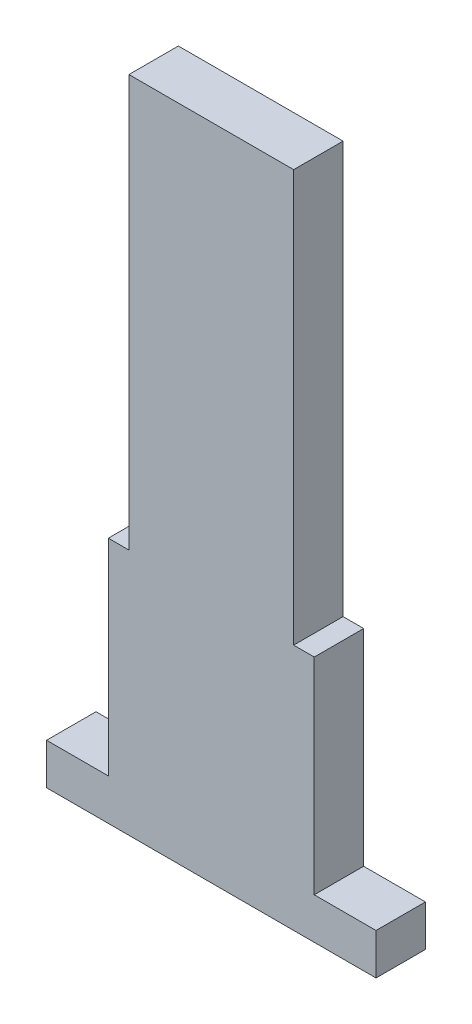
ISO-10303-21;
HEADER;
FILE_DESCRIPTION(('STEP AP214'),'2;1');
FILE_NAME('part.step','',(''),(''),'','','');
FILE_SCHEMA(('AUTOMOTIVE_DESIGN { 1 0 10303 214 1 1 1 1 }'));
ENDSEC;
DATA;
#1=APPLICATION_CONTEXT('core data for automotive mechanical design processes');
#2=APPLICATION_PROTOCOL_DEFINITION('international standard','automotive_design',2000,#1);
#3=PRODUCT_CONTEXT('',#1,'mechanical');
#4=PRODUCT('Part','Part','',(#3));
#5=PRODUCT_RELATED_PRODUCT_CATEGORY('part','',(#4));
#6=PRODUCT_DEFINITION_FORMATION('','',#4);
#7=PRODUCT_DEFINITION_CONTEXT('part definition',#1,'design');
#8=PRODUCT_DEFINITION('design','',#6,#7);
#9=PRODUCT_DEFINITION_SHAPE('','',#8);
#10=(LENGTH_UNIT() NAMED_UNIT(*) SI_UNIT(.MILLI.,.METRE.));
#11=(NAMED_UNIT(*) PLANE_ANGLE_UNIT() SI_UNIT($,.RADIAN.));
#12=(NAMED_UNIT(*) SI_UNIT($,.STERADIAN.) SOLID_ANGLE_UNIT());
#13=UNCERTAINTY_MEASURE_WITH_UNIT(LENGTH_MEASURE(1.E-05),#10,'distance_accuracy_value','');
#14=(GEOMETRIC_REPRESENTATION_CONTEXT(3) GLOBAL_UNCERTAINTY_ASSIGNED_CONTEXT((#13)) GLOBAL_UNIT_ASSIGNED_CONTEXT((#10,
#11,#12)) REPRESENTATION_CONTEXT('',''));
#15=CARTESIAN_POINT('',(0.,0.,0.));
#16=DIRECTION('',(0.,0.,1.));
#17=DIRECTION('',(1.,0.,0.));
#18=AXIS2_PLACEMENT_3D('',#15,#16,#17);
#19=CARTESIAN_POINT('',(-4.,0.,0.6));
#20=DIRECTION('',(0.,-1.,0.));
#21=DIRECTION('',(1.,0.,0.));
#22=AXIS2_PLACEMENT_3D('',#19,#20,#21);
#23=PLANE('',#22);
#24=DIRECTION('',(-1.,0.,0.));
#25=VECTOR('',#24,1.);
#26=CARTESIAN_POINT('',(-4.,0.,-0.6));
#27=LINE('',#26,#25);
#28=CARTESIAN_POINT('',(-2.5,0.,-0.6));
#29=VERTEX_POINT('',#28);
#30=CARTESIAN_POINT('',(-4.,0.,-0.6));
#31=VERTEX_POINT('',#30);
#32=EDGE_CURVE('E152',#29,#31,#27,.T.);
#33=ORIENTED_EDGE('',*,*,#32,.T.);
#34=DIRECTION('',(0.,0.,-1.));
#35=VECTOR('',#34,1.);
#36=CARTESIAN_POINT('',(-4.,0.,0.6));
#37=LINE('',#36,#35);
#38=CARTESIAN_POINT('',(-4.,0.,0.6));
#39=VERTEX_POINT('',#38);
#40=EDGE_CURVE('E11',#39,#31,#37,.T.);
#41=ORIENTED_EDGE('',*,*,#40,.F.);
#42=DIRECTION('',(-1.,0.,0.));
#43=VECTOR('',#42,1.);
#44=CARTESIAN_POINT('',(-4.,0.,0.6));
#45=LINE('',#44,#43);
#46=CARTESIAN_POINT('',(-2.5,0.,0.6));
#47=VERTEX_POINT('',#46);
#48=EDGE_CURVE('E174',#47,#39,#45,.T.);
#49=ORIENTED_EDGE('',*,*,#48,.F.);
#50=DIRECTION('',(0.,0.,-1.));
#51=VECTOR('',#50,1.);
#52=CARTESIAN_POINT('',(-2.5,0.,0.6));
#53=LINE('',#52,#51);
#54=EDGE_CURVE('E148',#47,#29,#53,.T.);
#55=ORIENTED_EDGE('',*,*,#54,.T.);
#56=EDGE_LOOP('',(#33,#41,#49,#55));
#57=FACE_BOUND('',#56,.T.);
#58=ADVANCED_FACE('F32',(#57),#23,.F.);
#59=CARTESIAN_POINT('',(-4.,0.,0.6));
#60=DIRECTION('',(1.,0.,0.));
#61=DIRECTION('',(0.,0.,-1.));
#62=AXIS2_PLACEMENT_3D('',#59,#60,#61);
#63=PLANE('',#62);
#64=DIRECTION('',(0.,-1.,0.));
#65=VECTOR('',#64,1.);
#66=CARTESIAN_POINT('',(-4.,0.,-0.6));
#67=LINE('',#66,#65);
#68=CARTESIAN_POINT('',(-4.,-0.999999999999992,-0.6));
#69=VERTEX_POINT('',#68);
#70=EDGE_CURVE('E155',#31,#69,#67,.T.);
#71=ORIENTED_EDGE('',*,*,#70,.T.);
#72=DIRECTION('',(0.,0.,-1.));
#73=VECTOR('',#72,1.);
#74=CARTESIAN_POINT('',(-4.,-0.999999999999992,0.6));
#75=LINE('',#74,#73);
#76=CARTESIAN_POINT('',(-4.,-0.999999999999992,0.6));
#77=VERTEX_POINT('',#76);
#78=EDGE_CURVE('E40',#77,#69,#75,.T.);
#79=ORIENTED_EDGE('',*,*,#78,.F.);
#80=DIRECTION('',(0.,-1.,0.));
#81=VECTOR('',#80,1.);
#82=CARTESIAN_POINT('',(-4.,0.,0.6));
#83=LINE('',#82,#81);
#84=EDGE_CURVE('E103',#39,#77,#83,.T.);
#85=ORIENTED_EDGE('',*,*,#84,.F.);
#86=ORIENTED_EDGE('',*,*,#40,.T.);
#87=EDGE_LOOP('',(#71,#79,#85,#86));
#88=FACE_BOUND('',#87,.T.);
#89=ADVANCED_FACE('F252',(#88),#63,.F.);
#90=CARTESIAN_POINT('',(-4.,-0.999999999999992,0.6));
#91=DIRECTION('',(0.,1.,0.));
#92=DIRECTION('',(-1.,0.,0.));
#93=AXIS2_PLACEMENT_3D('',#90,#91,#92);
#94=PLANE('',#93);
#95=DIRECTION('',(1.,0.,0.));
#96=VECTOR('',#95,1.);
#97=CARTESIAN_POINT('',(-4.,-0.999999999999992,-0.6));
#98=LINE('',#97,#96);
#99=CARTESIAN_POINT('',(4.,-0.999999999999993,-0.6));
#100=VERTEX_POINT('',#99);
#101=EDGE_CURVE('E157',#69,#100,#98,.T.);
#102=ORIENTED_EDGE('',*,*,#101,.T.);
#103=DIRECTION('',(0.,0.,-1.));
#104=VECTOR('',#103,1.);
#105=CARTESIAN_POINT('',(4.,-0.999999999999993,0.6));
#106=LINE('',#105,#104);
#107=CARTESIAN_POINT('',(4.,-0.999999999999993,0.6));
#108=VERTEX_POINT('',#107);
#109=EDGE_CURVE('E193',#108,#100,#106,.T.);
#110=ORIENTED_EDGE('',*,*,#109,.F.);
#111=DIRECTION('',(1.,0.,0.));
#112=VECTOR('',#111,1.);
#113=CARTESIAN_POINT('',(-4.,-0.999999999999992,0.6));
#114=LINE('',#113,#112);
#115=EDGE_CURVE('E201',#77,#108,#114,.T.);
#116=ORIENTED_EDGE('',*,*,#115,.F.);
#117=ORIENTED_EDGE('',*,*,#78,.T.);
#118=EDGE_LOOP('',(#102,#110,#116,#117));
#119=FACE_BOUND('',#118,.T.);
#120=ADVANCED_FACE('F199',(#119),#94,.F.);
#121=CARTESIAN_POINT('',(4.,0.,0.6));
#122=DIRECTION('',(-1.,0.,0.));
#123=DIRECTION('',(0.,0.,1.));
#124=AXIS2_PLACEMENT_3D('',#121,#122,#123);
#125=PLANE('',#124);
#126=DIRECTION('',(0.,1.,0.));
#127=VECTOR('',#126,1.);
#128=CARTESIAN_POINT('',(4.,0.,-0.6));
#129=LINE('',#128,#127);
#130=CARTESIAN_POINT('',(4.,0.,-0.6));
#131=VERTEX_POINT('',#130);
#132=EDGE_CURVE('E159',#100,#131,#129,.T.);
#133=ORIENTED_EDGE('',*,*,#132,.T.);
#134=DIRECTION('',(0.,0.,-1.));
#135=VECTOR('',#134,1.);
#136=CARTESIAN_POINT('',(4.,0.,0.6));
#137=LINE('',#136,#135);
#138=CARTESIAN_POINT('',(4.,0.,0.6));
#139=VERTEX_POINT('',#138);
#140=EDGE_CURVE('E190',#139,#131,#137,.T.);
#141=ORIENTED_EDGE('',*,*,#140,.F.);
#142=DIRECTION('',(0.,1.,0.));
#143=VECTOR('',#142,1.);
#144=CARTESIAN_POINT('',(4.,0.,0.6));
#145=LINE('',#144,#143);
#146=EDGE_CURVE('E219',#108,#139,#145,.T.);
#147=ORIENTED_EDGE('',*,*,#146,.F.);
#148=ORIENTED_EDGE('',*,*,#109,.T.);
#149=EDGE_LOOP('',(#133,#141,#147,#148));
#150=FACE_BOUND('',#149,.T.);
#151=ADVANCED_FACE('F210',(#150),#125,.F.);
#152=CARTESIAN_POINT('',(2.5,0.,0.6));
#153=DIRECTION('',(0.,-1.,0.));
#154=DIRECTION('',(0.,0.,-1.));
#155=AXIS2_PLACEMENT_3D('',#152,#153,#154);
#156=PLANE('',#155);
#157=DIRECTION('',(-1.,0.,0.));
#158=VECTOR('',#157,1.);
#159=CARTESIAN_POINT('',(2.5,0.,-0.6));
#160=LINE('',#159,#158);
#161=CARTESIAN_POINT('',(2.5,0.,-0.6));
#162=VERTEX_POINT('',#161);
#163=EDGE_CURVE('E161',#131,#162,#160,.T.);
#164=ORIENTED_EDGE('',*,*,#163,.T.);
#165=DIRECTION('',(0.,0.,-1.));
#166=VECTOR('',#165,1.);
#167=CARTESIAN_POINT('',(2.5,0.,0.6));
#168=LINE('',#167,#166);
#169=CARTESIAN_POINT('',(2.5,0.,0.6));
#170=VERTEX_POINT('',#169);
#171=EDGE_CURVE('E187',#170,#162,#168,.T.);
#172=ORIENTED_EDGE('',*,*,#171,.F.);
#173=DIRECTION('',(-1.,0.,0.));
#174=VECTOR('',#173,1.);
#175=CARTESIAN_POINT('',(2.5,0.,0.6));
#176=LINE('',#175,#174);
#177=EDGE_CURVE('E216',#139,#170,#176,.T.);
#178=ORIENTED_EDGE('',*,*,#177,.F.);
#179=ORIENTED_EDGE('',*,*,#140,.T.);
#180=EDGE_LOOP('',(#164,#172,#178,#179));
#181=FACE_BOUND('',#180,.T.);
#182=ADVANCED_FACE('F214',(#181),#156,.F.);
#183=CARTESIAN_POINT('',(2.5,0.,0.6));
#184=DIRECTION('',(-1.,0.,0.));
#185=DIRECTION('',(0.,0.,1.));
#186=AXIS2_PLACEMENT_3D('',#183,#184,#185);
#187=PLANE('',#186);
#188=DIRECTION('',(0.,1.,0.));
#189=VECTOR('',#188,1.);
#190=CARTESIAN_POINT('',(2.5,0.,-0.6));
#191=LINE('',#190,#189);
#192=CARTESIAN_POINT('',(2.5,5.,-0.6));
#193=VERTEX_POINT('',#192);
#194=EDGE_CURVE('E163',#162,#193,#191,.T.);
#195=ORIENTED_EDGE('',*,*,#194,.T.);
#196=DIRECTION('',(0.,0.,-1.));
#197=VECTOR('',#196,1.);
#198=CARTESIAN_POINT('',(2.5,5.,0.6));
#199=LINE('',#198,#197);
#200=CARTESIAN_POINT('',(2.5,5.,0.6));
#201=VERTEX_POINT('',#200);
#202=EDGE_CURVE('E184',#201,#193,#199,.T.);
#203=ORIENTED_EDGE('',*,*,#202,.F.);
#204=DIRECTION('',(0.,1.,0.));
#205=VECTOR('',#204,1.);
#206=CARTESIAN_POINT('',(2.5,0.,0.6));
#207=LINE('',#206,#205);
#208=EDGE_CURVE('E218',#170,#201,#207,.T.);
#209=ORIENTED_EDGE('',*,*,#208,.F.);
#210=ORIENTED_EDGE('',*,*,#171,.T.);
#211=EDGE_LOOP('',(#195,#203,#209,#210));
#212=FACE_BOUND('',#211,.T.);
#213=ADVANCED_FACE('F265',(#212),#187,.F.);
#214=CARTESIAN_POINT('',(2.,5.,0.6));
#215=DIRECTION('',(0.,-1.,0.));
#216=DIRECTION('',(1.,0.,0.));
#217=AXIS2_PLACEMENT_3D('',#214,#215,#216);
#218=PLANE('',#217);
#219=DIRECTION('',(-1.,0.,0.));
#220=VECTOR('',#219,1.);
#221=CARTESIAN_POINT('',(2.,5.,-0.6));
#222=LINE('',#221,#220);
#223=CARTESIAN_POINT('',(2.,5.,-0.6));
#224=VERTEX_POINT('',#223);
#225=EDGE_CURVE('E165',#193,#224,#222,.T.);
#226=ORIENTED_EDGE('',*,*,#225,.T.);
#227=DIRECTION('',(0.,0.,-1.));
#228=VECTOR('',#227,1.);
#229=CARTESIAN_POINT('',(2.,5.,0.6));
#230=LINE('',#229,#228);
#231=CARTESIAN_POINT('',(2.,5.,0.6));
#232=VERTEX_POINT('',#231);
#233=EDGE_CURVE('E181',#232,#224,#230,.T.);
#234=ORIENTED_EDGE('',*,*,#233,.F.);
#235=DIRECTION('',(-1.,0.,0.));
#236=VECTOR('',#235,1.);
#237=CARTESIAN_POINT('',(2.,5.,0.6));
#238=LINE('',#237,#236);
#239=EDGE_CURVE('E221',#201,#232,#238,.T.);
#240=ORIENTED_EDGE('',*,*,#239,.F.);
#241=ORIENTED_EDGE('',*,*,#202,.T.);
#242=EDGE_LOOP('',(#226,#234,#240,#241));
#243=FACE_BOUND('',#242,.T.);
#244=ADVANCED_FACE('F268',(#243),#218,.F.);
#245=CARTESIAN_POINT('',(2.,5.,0.6));
#246=DIRECTION('',(-1.,0.,0.));
#247=DIRECTION('',(0.,-1.,0.));
#248=AXIS2_PLACEMENT_3D('',#245,#246,#247);
#249=PLANE('',#248);
#250=DIRECTION('',(0.,1.,0.));
#251=VECTOR('',#250,1.);
#252=CARTESIAN_POINT('',(2.,5.,-0.6));
#253=LINE('',#252,#251);
#254=CARTESIAN_POINT('',(2.,15.,-0.6));
#255=VERTEX_POINT('',#254);
#256=EDGE_CURVE('E167',#224,#255,#253,.T.);
#257=ORIENTED_EDGE('',*,*,#256,.T.);
#258=DIRECTION('',(0.,0.,-1.));
#259=VECTOR('',#258,1.);
#260=CARTESIAN_POINT('',(2.,15.,0.6));
#261=LINE('',#260,#259);
#262=CARTESIAN_POINT('',(2.,15.,0.6));
#263=VERTEX_POINT('',#262);
#264=EDGE_CURVE('E178',#263,#255,#261,.T.);
#265=ORIENTED_EDGE('',*,*,#264,.F.);
#266=DIRECTION('',(0.,1.,0.));
#267=VECTOR('',#266,1.);
#268=CARTESIAN_POINT('',(2.,5.,0.6));
#269=LINE('',#268,#267);
#270=EDGE_CURVE('E227',#232,#263,#269,.T.);
#271=ORIENTED_EDGE('',*,*,#270,.F.);
#272=ORIENTED_EDGE('',*,*,#233,.T.);
#273=EDGE_LOOP('',(#257,#265,#271,#272));
#274=FACE_BOUND('',#273,.T.);
#275=ADVANCED_FACE('F233',(#274),#249,.F.);
#276=CARTESIAN_POINT('',(2.,15.,0.6));
#277=DIRECTION('',(0.,-1.,0.));
#278=DIRECTION('',(0.,0.,-1.));
#279=AXIS2_PLACEMENT_3D('',#276,#277,#278);
#280=PLANE('',#279);
#281=DIRECTION('',(-1.,0.,0.));
#282=VECTOR('',#281,1.);
#283=CARTESIAN_POINT('',(2.,15.,-0.6));
#284=LINE('',#283,#282);
#285=CARTESIAN_POINT('',(-2.,15.,-0.6));
#286=VERTEX_POINT('',#285);
#287=EDGE_CURVE('E169',#255,#286,#284,.T.);
#288=ORIENTED_EDGE('',*,*,#287,.T.);
#289=DIRECTION('',(0.,0.,-1.));
#290=VECTOR('',#289,1.);
#291=CARTESIAN_POINT('',(-2.,15.,0.6));
#292=LINE('',#291,#290);
#293=CARTESIAN_POINT('',(-2.,15.,0.6));
#294=VERTEX_POINT('',#293);
#295=EDGE_CURVE('E143',#294,#286,#292,.T.);
#296=ORIENTED_EDGE('',*,*,#295,.F.);
#297=DIRECTION('',(-1.,0.,0.));
#298=VECTOR('',#297,1.);
#299=CARTESIAN_POINT('',(2.,15.,0.6));
#300=LINE('',#299,#298);
#301=EDGE_CURVE('E134',#263,#294,#300,.T.);
#302=ORIENTED_EDGE('',*,*,#301,.F.);
#303=ORIENTED_EDGE('',*,*,#264,.T.);
#304=EDGE_LOOP('',(#288,#296,#302,#303));
#305=FACE_BOUND('',#304,.T.);
#306=ADVANCED_FACE('F237',(#305),#280,.F.);
#307=CARTESIAN_POINT('',(-2.,5.,0.6));
#308=DIRECTION('',(1.,0.,0.));
#309=DIRECTION('',(0.,1.,0.));
#310=AXIS2_PLACEMENT_3D('',#307,#308,#309);
#311=PLANE('',#310);
#312=DIRECTION('',(0.,-1.,0.));
#313=VECTOR('',#312,1.);
#314=CARTESIAN_POINT('',(-2.,5.,-0.6));
#315=LINE('',#314,#313);
#316=CARTESIAN_POINT('',(-2.,5.,-0.6));
#317=VERTEX_POINT('',#316);
#318=EDGE_CURVE('E142',#286,#317,#315,.T.);
#319=ORIENTED_EDGE('',*,*,#318,.T.);
#320=DIRECTION('',(0.,0.,-1.));
#321=VECTOR('',#320,1.);
#322=CARTESIAN_POINT('',(-2.,5.,0.6));
#323=LINE('',#322,#321);
#324=CARTESIAN_POINT('',(-2.,5.,0.6));
#325=VERTEX_POINT('',#324);
#326=EDGE_CURVE('E139',#325,#317,#323,.T.);
#327=ORIENTED_EDGE('',*,*,#326,.F.);
#328=DIRECTION('',(0.,-1.,0.));
#329=VECTOR('',#328,1.);
#330=CARTESIAN_POINT('',(-2.,5.,0.6));
#331=LINE('',#330,#329);
#332=EDGE_CURVE('E128',#294,#325,#331,.T.);
#333=ORIENTED_EDGE('',*,*,#332,.F.);
#334=ORIENTED_EDGE('',*,*,#295,.T.);
#335=EDGE_LOOP('',(#319,#327,#333,#334));
#336=FACE_BOUND('',#335,.T.);
#337=ADVANCED_FACE('F140',(#336),#311,.F.);
#338=CARTESIAN_POINT('',(-2.5,5.,0.6));
#339=DIRECTION('',(0.,-1.,0.));
#340=DIRECTION('',(0.,0.,-1.));
#341=AXIS2_PLACEMENT_3D('',#338,#339,#340);
#342=PLANE('',#341);
#343=DIRECTION('',(-1.,0.,0.));
#344=VECTOR('',#343,1.);
#345=CARTESIAN_POINT('',(-2.5,5.,-0.6));
#346=LINE('',#345,#344);
#347=CARTESIAN_POINT('',(-2.5,5.,-0.6));
#348=VERTEX_POINT('',#347);
#349=EDGE_CURVE('E89',#317,#348,#346,.T.);
#350=ORIENTED_EDGE('',*,*,#349,.T.);
#351=DIRECTION('',(0.,0.,-1.));
#352=VECTOR('',#351,1.);
#353=CARTESIAN_POINT('',(-2.5,5.,0.6));
#354=LINE('',#353,#352);
#355=CARTESIAN_POINT('',(-2.5,5.,0.6));
#356=VERTEX_POINT('',#355);
#357=EDGE_CURVE('E144',#356,#348,#354,.T.);
#358=ORIENTED_EDGE('',*,*,#357,.F.);
#359=DIRECTION('',(-1.,0.,0.));
#360=VECTOR('',#359,1.);
#361=CARTESIAN_POINT('',(-2.5,5.,0.6));
#362=LINE('',#361,#360);
#363=EDGE_CURVE('E132',#325,#356,#362,.T.);
#364=ORIENTED_EDGE('',*,*,#363,.F.);
#365=ORIENTED_EDGE('',*,*,#326,.T.);
#366=EDGE_LOOP('',(#350,#358,#364,#365));
#367=FACE_BOUND('',#366,.T.);
#368=ADVANCED_FACE('F146',(#367),#342,.F.);
#369=CARTESIAN_POINT('',(-2.5,0.,0.6));
#370=DIRECTION('',(1.,0.,0.));
#371=DIRECTION('',(0.,0.,-1.));
#372=AXIS2_PLACEMENT_3D('',#369,#370,#371);
#373=PLANE('',#372);
#374=DIRECTION('',(0.,-1.,0.));
#375=VECTOR('',#374,1.);
#376=CARTESIAN_POINT('',(-2.5,0.,-0.6));
#377=LINE('',#376,#375);
#378=EDGE_CURVE('E95',#348,#29,#377,.T.);
#379=ORIENTED_EDGE('',*,*,#378,.T.);
#380=ORIENTED_EDGE('',*,*,#54,.F.);
#381=DIRECTION('',(0.,-1.,0.));
#382=VECTOR('',#381,1.);
#383=CARTESIAN_POINT('',(-2.5,0.,0.6));
#384=LINE('',#383,#382);
#385=EDGE_CURVE('E48',#356,#47,#384,.T.);
#386=ORIENTED_EDGE('',*,*,#385,.F.);
#387=ORIENTED_EDGE('',*,*,#357,.T.);
#388=EDGE_LOOP('',(#379,#380,#386,#387));
#389=FACE_BOUND('',#388,.T.);
#390=ADVANCED_FACE('F241',(#389),#373,.F.);
#391=CARTESIAN_POINT('',(0.,0.,0.6));
#392=DIRECTION('',(0.,0.,1.));
#393=DIRECTION('',(1.,0.,0.));
#394=AXIS2_PLACEMENT_3D('',#391,#392,#393);
#395=PLANE('',#394);
#396=ORIENTED_EDGE('',*,*,#48,.T.);
#397=ORIENTED_EDGE('',*,*,#84,.T.);
#398=ORIENTED_EDGE('',*,*,#115,.T.);
#399=ORIENTED_EDGE('',*,*,#146,.T.);
#400=ORIENTED_EDGE('',*,*,#177,.T.);
#401=ORIENTED_EDGE('',*,*,#208,.T.);
#402=ORIENTED_EDGE('',*,*,#239,.T.);
#403=ORIENTED_EDGE('',*,*,#270,.T.);
#404=ORIENTED_EDGE('',*,*,#301,.T.);
#405=ORIENTED_EDGE('',*,*,#332,.T.);
#406=ORIENTED_EDGE('',*,*,#363,.T.);
#407=ORIENTED_EDGE('',*,*,#385,.T.);
#408=EDGE_LOOP('',(#396,#397,#398,#399,#400,#401,#402,#403,#404,#405,#406,#407));
#409=FACE_BOUND('',#408,.T.);
#410=ADVANCED_FACE('F130',(#409),#395,.T.);
#411=CARTESIAN_POINT('',(0.,0.,-0.6));
#412=DIRECTION('',(0.,0.,1.));
#413=DIRECTION('',(1.,0.,0.));
#414=AXIS2_PLACEMENT_3D('',#411,#412,#413);
#415=PLANE('',#414);
#416=ORIENTED_EDGE('',*,*,#32,.F.);
#417=ORIENTED_EDGE('',*,*,#378,.F.);
#418=ORIENTED_EDGE('',*,*,#349,.F.);
#419=ORIENTED_EDGE('',*,*,#318,.F.);
#420=ORIENTED_EDGE('',*,*,#287,.F.);
#421=ORIENTED_EDGE('',*,*,#256,.F.);
#422=ORIENTED_EDGE('',*,*,#225,.F.);
#423=ORIENTED_EDGE('',*,*,#194,.F.);
#424=ORIENTED_EDGE('',*,*,#163,.F.);
#425=ORIENTED_EDGE('',*,*,#132,.F.);
#426=ORIENTED_EDGE('',*,*,#101,.F.);
#427=ORIENTED_EDGE('',*,*,#70,.F.);
#428=EDGE_LOOP('',(#416,#417,#418,#419,#420,#421,#422,#423,#424,#425,#426,#427));
#429=FACE_BOUND('',#428,.T.);
#430=ADVANCED_FACE('F205',(#429),#415,.F.);
#431=CLOSED_SHELL('',(#58,#89,#120,#151,#182,#213,#244,#275,#306,#337,#368,#390,#410,#430));
#432=MANIFOLD_SOLID_BREP('B2',#431);
#433=ADVANCED_BREP_SHAPE_REPRESENTATION('',(#18,#432),#14);
#434=SHAPE_DEFINITION_REPRESENTATION(#9,#433);
ENDSEC;
END-ISO-10303-21;
